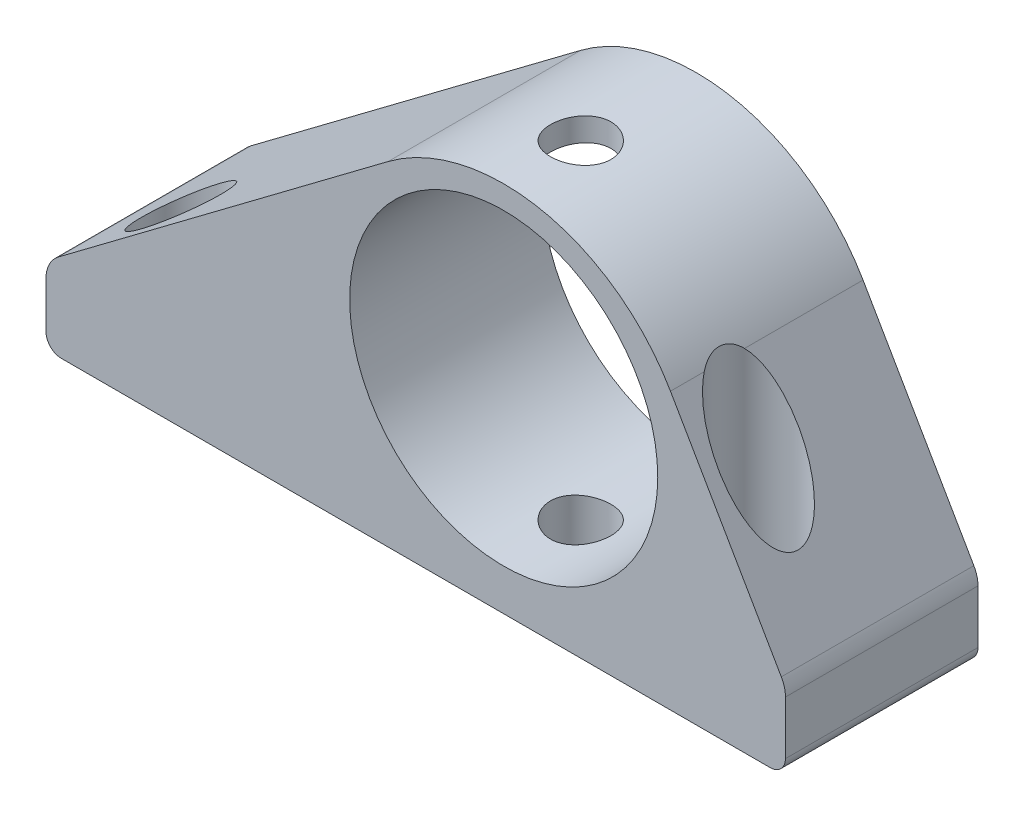
ISO-10303-21;
HEADER;
FILE_DESCRIPTION(('STEP AP214'),'2;1');
FILE_NAME('part.step','',(''),(''),'','','');
FILE_SCHEMA(('AUTOMOTIVE_DESIGN { 1 0 10303 214 1 1 1 1 }'));
ENDSEC;
DATA;
#1=APPLICATION_CONTEXT('core data for automotive mechanical design processes');
#2=APPLICATION_PROTOCOL_DEFINITION('international standard','automotive_design',2000,#1);
#3=PRODUCT_CONTEXT('',#1,'mechanical');
#4=PRODUCT('Part','Part','',(#3));
#5=PRODUCT_RELATED_PRODUCT_CATEGORY('part','',(#4));
#6=PRODUCT_DEFINITION_FORMATION('','',#4);
#7=PRODUCT_DEFINITION_CONTEXT('part definition',#1,'design');
#8=PRODUCT_DEFINITION('design','',#6,#7);
#9=PRODUCT_DEFINITION_SHAPE('','',#8);
#10=(LENGTH_UNIT() NAMED_UNIT(*) SI_UNIT(.MILLI.,.METRE.));
#11=(NAMED_UNIT(*) PLANE_ANGLE_UNIT() SI_UNIT($,.RADIAN.));
#12=(NAMED_UNIT(*) SI_UNIT($,.STERADIAN.) SOLID_ANGLE_UNIT());
#13=UNCERTAINTY_MEASURE_WITH_UNIT(LENGTH_MEASURE(1.E-05),#10,'distance_accuracy_value','');
#14=(GEOMETRIC_REPRESENTATION_CONTEXT(3) GLOBAL_UNCERTAINTY_ASSIGNED_CONTEXT((#13)) GLOBAL_UNIT_ASSIGNED_CONTEXT((#10,
#11,#12)) REPRESENTATION_CONTEXT('',''));
#15=CARTESIAN_POINT('',(0.,0.,0.));
#16=DIRECTION('',(0.,0.,1.));
#17=DIRECTION('',(1.,0.,0.));
#18=AXIS2_PLACEMENT_3D('',#15,#16,#17);
#19=CARTESIAN_POINT('',(30.48,0.,15.875));
#20=DIRECTION('',(0.,1.,0.));
#21=DIRECTION('',(-1.,0.,0.));
#22=AXIS2_PLACEMENT_3D('',#19,#20,#21);
#23=PLANE('',#22);
#24=CARTESIAN_POINT('',(-23.8125,0.,11.43));
#25=DIRECTION('',(0.,-1.,0.));
#26=DIRECTION('',(1.,0.,0.));
#27=AXIS2_PLACEMENT_3D('',#24,#25,#26);
#28=CIRCLE('',#27,3.2639);
#29=CARTESIAN_POINT('',(-20.5486,0.,11.43));
#30=VERTEX_POINT('',#29);
#31=EDGE_CURVE('E421',#30,#30,#28,.T.);
#32=ORIENTED_EDGE('',*,*,#31,.F.);
#33=EDGE_LOOP('',(#32));
#34=FACE_BOUND('',#33,.T.);
#35=CARTESIAN_POINT('',(7.25400300007424,0.,9.525));
#36=DIRECTION('',(0.,-1.,0.));
#37=DIRECTION('',(1.,0.,0.));
#38=AXIS2_PLACEMENT_3D('',#35,#36,#37);
#39=CIRCLE('',#38,2.4892);
#40=CARTESIAN_POINT('',(9.74320300007424,0.,9.525));
#41=VERTEX_POINT('',#40);
#42=EDGE_CURVE('E157',#41,#41,#39,.T.);
#43=ORIENTED_EDGE('',*,*,#42,.F.);
#44=EDGE_LOOP('',(#43));
#45=FACE_BOUND('',#44,.T.);
#46=DIRECTION('',(1.,0.,0.));
#47=VECTOR('',#46,1.);
#48=CARTESIAN_POINT('',(30.48,0.,0.));
#49=LINE('',#48,#47);
#50=CARTESIAN_POINT('',(-29.21,0.,0.));
#51=VERTEX_POINT('',#50);
#52=CARTESIAN_POINT('',(29.21,0.,0.));
#53=VERTEX_POINT('',#52);
#54=EDGE_CURVE('E251',#51,#53,#49,.T.);
#55=ORIENTED_EDGE('',*,*,#54,.T.);
#56=DIRECTION('',(0.,0.,-1.));
#57=VECTOR('',#56,1.);
#58=CARTESIAN_POINT('',(29.21,0.,15.875));
#59=LINE('',#58,#57);
#60=CARTESIAN_POINT('',(29.21,0.,15.875));
#61=VERTEX_POINT('',#60);
#62=EDGE_CURVE('E54',#53,#61,#59,.F.);
#63=ORIENTED_EDGE('',*,*,#62,.T.);
#64=DIRECTION('',(1.,0.,0.));
#65=VECTOR('',#64,1.);
#66=CARTESIAN_POINT('',(30.48,0.,15.875));
#67=LINE('',#66,#65);
#68=CARTESIAN_POINT('',(-29.21,0.,15.875));
#69=VERTEX_POINT('',#68);
#70=EDGE_CURVE('E237',#69,#61,#67,.T.);
#71=ORIENTED_EDGE('',*,*,#70,.F.);
#72=DIRECTION('',(0.,0.,-1.));
#73=VECTOR('',#72,1.);
#74=CARTESIAN_POINT('',(-29.21,0.,15.875));
#75=LINE('',#74,#73);
#76=EDGE_CURVE('E227',#69,#51,#75,.T.);
#77=ORIENTED_EDGE('',*,*,#76,.T.);
#78=EDGE_LOOP('',(#55,#63,#71,#77));
#79=FACE_BOUND('',#78,.T.);
#80=CARTESIAN_POINT('',(23.8125,0.,11.43));
#81=DIRECTION('',(0.,1.,0.));
#82=DIRECTION('',(-1.,0.,0.));
#83=AXIS2_PLACEMENT_3D('',#80,#81,#82);
#84=CIRCLE('',#83,3.2639);
#85=CARTESIAN_POINT('',(20.5486,0.,11.43));
#86=VERTEX_POINT('',#85);
#87=EDGE_CURVE('E423',#86,#86,#84,.T.);
#88=ORIENTED_EDGE('',*,*,#87,.T.);
#89=EDGE_LOOP('',(#88));
#90=FACE_BOUND('',#89,.T.);
#91=ADVANCED_FACE('F33',(#34,#45,#79,#90),#23,.F.);
#92=CARTESIAN_POINT('',(7.25400300007437,14.8286068603137,15.875));
#93=DIRECTION('',(0.,0.,-1.));
#94=DIRECTION('',(-1.,0.,0.));
#95=AXIS2_PLACEMENT_3D('',#92,#93,#94);
#96=CYLINDRICAL_SURFACE('',#95,15.875);
#97=CARTESIAN_POINT('',(7.25400300007436,30.7036068603138,7.0358));
#98=CARTESIAN_POINT('',(7.11509694516908,30.7036045670808,7.03580566830738));
#99=CARTESIAN_POINT('',(6.97611218193528,30.7017646601866,7.04746642785592));
#100=CARTESIAN_POINT('',(6.70203273456269,30.6946020213534,7.09378656350196));
#101=CARTESIAN_POINT('',(6.56694188282754,30.6892759728483,7.12846784077943));
#102=CARTESIAN_POINT('',(6.30465595873273,30.6757391275832,7.2197628200422));
#103=CARTESIAN_POINT('',(6.17745481318327,30.667530582914,7.27635940315972));
#104=CARTESIAN_POINT('',(5.93437285248977,30.649134007626,7.40983538252462));
#105=CARTESIAN_POINT('',(5.81849057811306,30.6389462326777,7.48671215950087));
#106=CARTESIAN_POINT('',(5.60033208226753,30.6176258243704,7.65926248892496));
#107=CARTESIAN_POINT('',(5.49816608869203,30.606486591927,7.75507460388897));
#108=CARTESIAN_POINT('',(5.31129175300056,30.584569925567,7.96247763511765));
#109=CARTESIAN_POINT('',(5.2265844527291,30.5737925132742,8.07406949236609));
#110=CARTESIAN_POINT('',(5.07659786405079,30.5537557811859,8.31061159654532));
#111=CARTESIAN_POINT('',(5.01142616602649,30.5445049901566,8.43563084963722));
#112=CARTESIAN_POINT('',(4.90304851035311,30.5286596153741,8.69501078415886));
#113=CARTESIAN_POINT('',(4.85984124295902,30.5220648732449,8.82937090804668));
#114=CARTESIAN_POINT('',(4.796963270964,30.5123434963266,9.10245557095464));
#115=CARTESIAN_POINT('',(4.77710320592831,30.5091889745406,9.24113549846165));
#116=CARTESIAN_POINT('',(4.76089657591027,30.5066206687459,9.5198926166484));
#117=CARTESIAN_POINT('',(4.76454853711459,30.5072066502696,9.65996971919892));
#118=CARTESIAN_POINT('',(4.79510774717881,30.5120276567733,9.93620169534438));
#119=CARTESIAN_POINT('',(4.82180337883591,30.5162294753171,10.0723806432635));
#120=CARTESIAN_POINT('',(4.8973605430947,30.527756802887,10.3383023139324));
#121=CARTESIAN_POINT('',(4.94622275573279,30.5350824077457,10.4680448390872));
#122=CARTESIAN_POINT('',(5.06494395719598,30.5520682573595,10.7180505107717));
#123=CARTESIAN_POINT('',(5.13489188306559,30.5617383564174,10.838270726423));
#124=CARTESIAN_POINT('',(5.29373568546492,30.5823166097519,11.0653477084882));
#125=CARTESIAN_POINT('',(5.38263291891857,30.5932248526635,11.1722035170324));
#126=CARTESIAN_POINT('',(5.5780100666752,30.6151967100365,11.3707443017527));
#127=CARTESIAN_POINT('',(5.68467177504527,30.6262607183034,11.4622504315872));
#128=CARTESIAN_POINT('',(5.91193242728109,30.6471868004637,11.6260915712206));
#129=CARTESIAN_POINT('',(6.0325314428575,30.6570488681723,11.6984264823729));
#130=CARTESIAN_POINT('',(6.28440356404981,30.6744715991477,11.8218838501579));
#131=CARTESIAN_POINT('',(6.41568393735495,30.6820306785657,11.8729917169162));
#132=CARTESIAN_POINT('',(6.68510938025784,30.693982711525,11.9523846061197));
#133=CARTESIAN_POINT('',(6.8232539414809,30.6983758991658,11.9806713160762));
#134=CARTESIAN_POINT('',(7.10094359993342,30.7034699636867,12.0133792873864));
#135=CARTESIAN_POINT('',(7.24045908082882,30.7042088572259,12.0180462832909));
#136=CARTESIAN_POINT('',(7.51827959411447,30.7020148184516,12.0040357439755));
#137=CARTESIAN_POINT('',(7.65658466740221,30.6990820106842,11.9853590005889));
#138=CARTESIAN_POINT('',(7.92730824076356,30.6898976195341,11.9253955128908));
#139=CARTESIAN_POINT('',(8.05975407998652,30.6836637272211,11.8842292567787));
#140=CARTESIAN_POINT('',(8.31586409195264,30.6685736529816,11.7805829101506));
#141=CARTESIAN_POINT('',(8.43952781928167,30.6597173381678,11.7181017395089));
#142=CARTESIAN_POINT('',(8.67563860325786,30.6402714771111,11.5730280962491));
#143=CARTESIAN_POINT('',(8.78798935863075,30.6296687944836,11.4902806848561));
#144=CARTESIAN_POINT('',(8.99729740357999,30.607949148022,11.3072381432372));
#145=CARTESIAN_POINT('',(9.09425370997436,30.5968321513994,11.2069418930963));
#146=CARTESIAN_POINT('',(9.27092141526545,30.5752153365864,10.990551469592));
#147=CARTESIAN_POINT('',(9.3504675633996,30.5647220679579,10.8743216252251));
#148=CARTESIAN_POINT('',(9.48890613070782,30.5456592820025,10.630005260061));
#149=CARTESIAN_POINT('',(9.54779914763274,30.537089709002,10.50191908255));
#150=CARTESIAN_POINT('',(9.64300711014341,30.5228927057636,10.2380065380912));
#151=CARTESIAN_POINT('',(9.67940715067546,30.5172541997979,10.1022114919798));
#152=CARTESIAN_POINT('',(9.72886557579246,30.5095289481787,9.82633991313192));
#153=CARTESIAN_POINT('',(9.74192573584276,30.5074419323638,9.68626370688804));
#154=CARTESIAN_POINT('',(9.74428853977138,30.5070666718644,9.40745431443618));
#155=CARTESIAN_POINT('',(9.7338511167597,30.5087368643308,9.26872331762411));
#156=CARTESIAN_POINT('',(9.6900740514347,30.515597201827,8.99501636082486));
#157=CARTESIAN_POINT('',(9.65673445991303,30.5207873390504,8.86004039251059));
#158=CARTESIAN_POINT('',(9.56819443372131,30.534087734728,8.59775830460762));
#159=CARTESIAN_POINT('',(9.51301384157173,30.5421953420586,8.47044534380261));
#160=CARTESIAN_POINT('',(9.38238434924553,30.5604201058444,8.226842109909));
#161=CARTESIAN_POINT('',(9.30693463532861,30.5705373429755,8.11055227961739));
#162=CARTESIAN_POINT('',(9.13697081950566,30.5917743120337,7.89097857161323));
#163=CARTESIAN_POINT('',(9.04226469105313,30.6029034623595,7.78784422655511));
#164=CARTESIAN_POINT('',(8.83688213281055,30.62483305306,7.59884086657932));
#165=CARTESIAN_POINT('',(8.72620200791413,30.6356334166778,7.51297585743608));
#166=CARTESIAN_POINT('',(8.49122209404987,30.6557636174166,7.3604800108145));
#167=CARTESIAN_POINT('',(8.36684397860286,30.6650841653116,7.29396864775475));
#168=CARTESIAN_POINT('',(8.10859057986397,30.6811138402597,7.18288238350642));
#169=CARTESIAN_POINT('',(7.9747251443983,30.6878256295893,7.13828510632219));
#170=CARTESIAN_POINT('',(7.74257567355938,30.6963760297984,7.08223803977048));
#171=CARTESIAN_POINT('',(7.64571373853054,30.6990734420586,7.06485088867004));
#172=CARTESIAN_POINT('',(7.45058199718362,30.7026896561761,7.0416299450843));
#173=CARTESIAN_POINT('',(7.35231221090446,30.7036084833238,7.03579598831868));
#174=CARTESIAN_POINT('',(7.25400300007436,30.7036068603138,7.0358));
#175=B_SPLINE_CURVE_WITH_KNOTS('',3,(#97,#98,#99,#100,#101,#102,#103,#104,#105,#106,#107,#108,
#109,#110,#111,#112,#113,#114,#115,#116,#117,#118,#119,#120,#121,#122,#123,#124,#125,#126,#127,
#128,#129,#130,#131,#132,#133,#134,#135,#136,#137,#138,#139,#140,#141,#142,#143,#144,#145,#146,
#147,#148,#149,#150,#151,#152,#153,#154,#155,#156,#157,#158,#159,#160,#161,#162,#163,#164,#165,
#166,#167,#168,#169,#170,#171,#172,#173,#174),.UNSPECIFIED.,.T.,.F.,(4,2,2,2,2,2,2,2,2,2,2,2,2,
2,2,2,2,2,2,2,2,2,2,2,2,2,2,2,2,2,2,2,2,2,2,2,2,2,4),(0.,0.416358886850114,0.833114456601983,
1.24954513752971,1.66592206101775,2.08546693141594,2.50503683083742,2.9268767192471,
3.34869145027715,3.76706086480886,4.18540405478608,4.5999458526052,5.01450036878518,
5.43082849175457,5.8471864372113,6.26810144417728,6.68901861694429,7.11022461967684,
7.5313994734613,7.94818337190888,8.36495313318789,8.77951162893622,9.19409113540896,
9.61194492985803,10.0298254002349,10.4515150266721,10.8731924473988,11.2932646607082,
11.7133049177523,12.1287214978065,12.5441371565667,12.9591762738235,13.3742320560615,
13.793649932368,14.213164984421,14.6352173742595,15.0568379154241,15.3515154632021,
15.6461888207907),.UNSPECIFIED.);
#176=CARTESIAN_POINT('',(7.25400300007436,30.7036068603138,7.0358));
#177=VERTEX_POINT('',#176);
#178=EDGE_CURVE('E136',#177,#177,#175,.T.);
#179=ORIENTED_EDGE('',*,*,#178,.F.);
#180=EDGE_LOOP('',(#179));
#181=FACE_BOUND('',#180,.T.);
#182=DIRECTION('',(0.,0.,-1.));
#183=VECTOR('',#182,1.);
#184=CARTESIAN_POINT('',(21.0021562851524,22.7661068603137,15.875));
#185=LINE('',#184,#183);
#186=CARTESIAN_POINT('',(21.0021562851524,22.7661068603137,13.0898227057178));
#187=VERTEX_POINT('',#186);
#188=CARTESIAN_POINT('',(21.0021562851524,22.7661068603137,15.875));
#189=VERTEX_POINT('',#188);
#190=EDGE_CURVE('E132',#187,#189,#185,.F.);
#191=ORIENTED_EDGE('',*,*,#190,.F.);
#192=CARTESIAN_POINT('',(21.0021562851524,22.7661068603137,13.0898227057178));
#193=CARTESIAN_POINT('',(20.9533733668285,22.8506642981998,13.0072056712202));
#194=CARTESIAN_POINT('',(20.9059806513669,22.9308834683026,12.9186482306213));
#195=CARTESIAN_POINT('',(20.8161566126228,23.0803375507149,12.7285343637837));
#196=CARTESIAN_POINT('',(20.7737923904778,23.1494275345428,12.6268333853953));
#197=CARTESIAN_POINT('',(20.6972629948974,23.2725250502104,12.4105821737075));
#198=CARTESIAN_POINT('',(20.663155677112,23.3264265652036,12.2959490810612));
#199=CARTESIAN_POINT('',(20.6070599093164,23.4143066322154,12.0569972875116));
#200=CARTESIAN_POINT('',(20.5850107900353,23.4483849781978,11.9327307345026));
#201=CARTESIAN_POINT('',(20.557105483573,23.4913828134271,11.6918431381413));
#202=CARTESIAN_POINT('',(20.5497833305059,23.5025819694709,11.5758034890898));
#203=CARTESIAN_POINT('',(20.5476838890129,23.5058003594034,11.3432610913329));
#204=CARTESIAN_POINT('',(20.5529117954202,23.4978116508784,11.2267581707929));
#205=CARTESIAN_POINT('',(20.5738252099067,23.4656343985773,11.0127869718901));
#206=CARTESIAN_POINT('',(20.588055815753,23.4436977657935,10.9148198564839));
#207=CARTESIAN_POINT('',(20.6243594611198,23.387246626405,10.7241436924463));
#208=CARTESIAN_POINT('',(20.6464349132975,23.3527282502418,10.6314362716002));
#209=CARTESIAN_POINT('',(20.7061316561934,23.258315389416,10.4202817276119));
#210=CARTESIAN_POINT('',(20.7464873165251,23.1937578904489,10.3046991713266));
#211=CARTESIAN_POINT('',(20.835187881972,23.0489596235374,10.0874275887423));
#212=CARTESIAN_POINT('',(20.8835399489173,22.968704784688,9.98575116771974));
#213=CARTESIAN_POINT('',(20.9564934029945,22.8448008503922,9.84934535525286));
#214=CARTESIAN_POINT('',(20.9791626099352,22.805941967419,9.80911854426729));
#215=CARTESIAN_POINT('',(21.0021562851523,22.7661068603139,9.77017729428192));
#216=B_SPLINE_CURVE_WITH_KNOTS('',3,(#192,#193,#194,#195,#196,#197,#198,#199,#200,#201,#202,
#203,#204,#205,#206,#207,#208,#209,#210,#211,#212,#213,#214,#215),.UNSPECIFIED.,.F.,.F.,(4,2,2,
2,2,2,2,2,2,2,2,4),(0.,0.38412317117787,0.772902376602331,1.16433162437198,1.5537728900391,
1.90202601303818,2.25042331294998,2.55332079770331,2.85631151833553,3.26923036669984,
3.68252106098251,3.86342961856172),.UNSPECIFIED.);
#217=CARTESIAN_POINT('',(21.0021562851524,22.7661068603137,9.77017729428215));
#218=VERTEX_POINT('',#217);
#219=EDGE_CURVE('E117',#187,#218,#216,.T.);
#220=ORIENTED_EDGE('',*,*,#219,.T.);
#221=CARTESIAN_POINT('',(21.0021562851524,22.7661068603137,0.));
#222=VERTEX_POINT('',#221);
#223=EDGE_CURVE('E134',#222,#218,#185,.F.);
#224=ORIENTED_EDGE('',*,*,#223,.F.);
#225=CARTESIAN_POINT('',(7.25400300007437,14.8286068603137,0.));
#226=DIRECTION('',(0.,0.,1.));
#227=DIRECTION('',(1.,0.,0.));
#228=AXIS2_PLACEMENT_3D('',#225,#226,#227);
#229=CIRCLE('',#228,15.875);
#230=CARTESIAN_POINT('',(-2.27729126755683,27.523883721565,0.));
#231=VERTEX_POINT('',#230);
#232=EDGE_CURVE('E140',#231,#222,#229,.F.);
#233=ORIENTED_EDGE('',*,*,#232,.F.);
#234=DIRECTION('',(0.,0.,-1.));
#235=VECTOR('',#234,1.);
#236=CARTESIAN_POINT('',(-2.27729126755683,27.523883721565,15.875));
#237=LINE('',#236,#235);
#238=CARTESIAN_POINT('',(-2.27729126755683,27.523883721565,15.875));
#239=VERTEX_POINT('',#238);
#240=EDGE_CURVE('E143',#239,#231,#237,.T.);
#241=ORIENTED_EDGE('',*,*,#240,.F.);
#242=CARTESIAN_POINT('',(7.25400300007437,14.8286068603137,15.875));
#243=DIRECTION('',(0.,0.,1.));
#244=DIRECTION('',(1.,0.,0.));
#245=AXIS2_PLACEMENT_3D('',#242,#243,#244);
#246=CIRCLE('',#245,15.875);
#247=EDGE_CURVE('E126',#189,#239,#246,.T.);
#248=ORIENTED_EDGE('',*,*,#247,.F.);
#249=EDGE_LOOP('',(#191,#220,#224,#233,#241,#248));
#250=FACE_BOUND('',#249,.T.);
#251=ADVANCED_FACE('F138',(#181,#250),#96,.T.);
#252=CARTESIAN_POINT('',(-30.48,0.,15.875));
#253=DIRECTION('',(1.,0.,0.));
#254=DIRECTION('',(0.,0.,-1.));
#255=AXIS2_PLACEMENT_3D('',#252,#253,#254);
#256=PLANE('',#255);
#257=DIRECTION('',(0.,-1.,0.));
#258=VECTOR('',#257,1.);
#259=CARTESIAN_POINT('',(-30.48,0.,0.));
#260=LINE('',#259,#258);
#261=CARTESIAN_POINT('',(-30.48,5.08078683227482,0.));
#262=VERTEX_POINT('',#261);
#263=CARTESIAN_POINT('',(-30.48,1.27,0.));
#264=VERTEX_POINT('',#263);
#265=EDGE_CURVE('E255',#262,#264,#260,.T.);
#266=ORIENTED_EDGE('',*,*,#265,.T.);
#267=DIRECTION('',(0.,0.,-1.));
#268=VECTOR('',#267,1.);
#269=CARTESIAN_POINT('',(-30.48,1.27,15.875));
#270=LINE('',#269,#268);
#271=CARTESIAN_POINT('',(-30.48,1.27,15.875));
#272=VERTEX_POINT('',#271);
#273=EDGE_CURVE('E11',#264,#272,#270,.F.);
#274=ORIENTED_EDGE('',*,*,#273,.T.);
#275=DIRECTION('',(0.,-1.,0.));
#276=VECTOR('',#275,1.);
#277=CARTESIAN_POINT('',(-30.48,0.,15.875));
#278=LINE('',#277,#276);
#279=CARTESIAN_POINT('',(-30.48,5.08078683227482,15.875));
#280=VERTEX_POINT('',#279);
#281=EDGE_CURVE('E266',#280,#272,#278,.T.);
#282=ORIENTED_EDGE('',*,*,#281,.F.);
#283=DIRECTION('',(0.,0.,-1.));
#284=VECTOR('',#283,1.);
#285=CARTESIAN_POINT('',(-30.48,5.08078683227482,15.875));
#286=LINE('',#285,#284);
#287=EDGE_CURVE('E125',#280,#262,#286,.T.);
#288=ORIENTED_EDGE('',*,*,#287,.T.);
#289=EDGE_LOOP('',(#266,#274,#282,#288));
#290=FACE_BOUND('',#289,.T.);
#291=ADVANCED_FACE('F187',(#290),#256,.F.);
#292=CARTESIAN_POINT('',(30.48,6.35000000000001,15.875));
#293=DIRECTION('',(-1.,0.,0.));
#294=DIRECTION('',(0.,-1.,0.));
#295=AXIS2_PLACEMENT_3D('',#292,#293,#294);
#296=PLANE('',#295);
#297=DIRECTION('',(0.,1.,0.));
#298=VECTOR('',#297,1.);
#299=CARTESIAN_POINT('',(30.48,6.35000000000001,15.875));
#300=LINE('',#299,#298);
#301=CARTESIAN_POINT('',(30.48,1.27000000000002,15.875));
#302=VERTEX_POINT('',#301);
#303=CARTESIAN_POINT('',(30.48,5.66940905122498,15.875));
#304=VERTEX_POINT('',#303);
#305=EDGE_CURVE('E236',#302,#304,#300,.T.);
#306=ORIENTED_EDGE('',*,*,#305,.F.);
#307=DIRECTION('',(0.,0.,-1.));
#308=VECTOR('',#307,1.);
#309=CARTESIAN_POINT('',(30.48,1.27000000000002,15.875));
#310=LINE('',#309,#308);
#311=CARTESIAN_POINT('',(30.48,1.27000000000002,0.));
#312=VERTEX_POINT('',#311);
#313=EDGE_CURVE('E220',#302,#312,#310,.T.);
#314=ORIENTED_EDGE('',*,*,#313,.T.);
#315=DIRECTION('',(0.,1.,0.));
#316=VECTOR('',#315,1.);
#317=CARTESIAN_POINT('',(30.48,6.35000000000001,0.));
#318=LINE('',#317,#316);
#319=CARTESIAN_POINT('',(30.48,5.66940905122498,0.));
#320=VERTEX_POINT('',#319);
#321=EDGE_CURVE('E252',#312,#320,#318,.T.);
#322=ORIENTED_EDGE('',*,*,#321,.T.);
#323=DIRECTION('',(0.,0.,-1.));
#324=VECTOR('',#323,1.);
#325=CARTESIAN_POINT('',(30.48,5.66940905122498,15.875));
#326=LINE('',#325,#324);
#327=EDGE_CURVE('E217',#320,#304,#326,.F.);
#328=ORIENTED_EDGE('',*,*,#327,.T.);
#329=EDGE_LOOP('',(#306,#314,#322,#328));
#330=FACE_BOUND('',#329,.T.);
#331=ADVANCED_FACE('F241',(#330),#296,.F.);
#332=CARTESIAN_POINT('',(12.0464729957814,38.277805334,15.875));
#333=DIRECTION('',(-0.866025403784442,-0.499999999999995,0.));
#334=DIRECTION('',(0.499999999999995,-0.866025403784442,0.));
#335=AXIS2_PLACEMENT_3D('',#332,#333,#334);
#336=PLANE('',#335);
#337=DIRECTION('',(-0.499999999999995,0.866025403784442,0.));
#338=VECTOR('',#337,1.);
#339=CARTESIAN_POINT('',(12.0464729957814,38.277805334,15.875));
#340=LINE('',#339,#338);
#341=CARTESIAN_POINT('',(30.1397045256125,6.93940905122496,15.875));
#342=VERTEX_POINT('',#341);
#343=EDGE_CURVE('E245',#342,#189,#340,.T.);
#344=ORIENTED_EDGE('',*,*,#343,.F.);
#345=DIRECTION('',(0.,0.,-1.));
#346=VECTOR('',#345,1.);
#347=CARTESIAN_POINT('',(30.1397045256125,6.93940905122496,15.875));
#348=LINE('',#347,#346);
#349=CARTESIAN_POINT('',(30.1397045256125,6.93940905122496,0.));
#350=VERTEX_POINT('',#349);
#351=EDGE_CURVE('E214',#342,#350,#348,.T.);
#352=ORIENTED_EDGE('',*,*,#351,.T.);
#353=DIRECTION('',(-0.499999999999995,0.866025403784442,0.));
#354=VECTOR('',#353,1.);
#355=CARTESIAN_POINT('',(12.0464729957814,38.277805334,0.));
#356=LINE('',#355,#354);
#357=EDGE_CURVE('E257',#350,#222,#356,.T.);
#358=ORIENTED_EDGE('',*,*,#357,.T.);
#359=ORIENTED_EDGE('',*,*,#223,.T.);
#360=CARTESIAN_POINT('',(23.8125,17.8984487594657,11.43));
#361=DIRECTION('',(-0.866025403784442,-0.499999999999995,0.));
#362=DIRECTION('',(0.499999999999995,-0.866025403784442,0.));
#363=AXIS2_PLACEMENT_3D('',#360,#361,#362);
#364=ELLIPSE('',#363,6.52780000000007,3.2639);
#365=EDGE_CURVE('E120',#187,#218,#364,.F.);
#366=ORIENTED_EDGE('',*,*,#365,.F.);
#367=ORIENTED_EDGE('',*,*,#190,.T.);
#368=EDGE_LOOP('',(#344,#352,#358,#359,#366,#367));
#369=FACE_BOUND('',#368,.T.);
#370=ADVANCED_FACE('F131',(#369),#336,.F.);
#371=CARTESIAN_POINT('',(-30.48,6.34999999999999,15.875));
#372=DIRECTION('',(0.600396489299603,-0.799702479448896,0.));
#373=DIRECTION('',(0.799702479448896,0.600396489299603,0.));
#374=AXIS2_PLACEMENT_3D('',#371,#372,#373);
#375=PLANE('',#374);
#376=CARTESIAN_POINT('',(-23.8125,11.3557911476826,11.43));
#377=DIRECTION('',(0.600396489299603,-0.799702479448896,0.));
#378=DIRECTION('',(-0.799702479448896,-0.600396489299603,0.));
#379=AXIS2_PLACEMENT_3D('',#376,#377,#378);
#380=ELLIPSE('',#379,4.08139287282099,3.2639);
#381=CARTESIAN_POINT('',(-27.0764,8.90533719538843,11.43));
#382=VERTEX_POINT('',#381);
#383=EDGE_CURVE('E135',#382,#382,#380,.T.);
#384=ORIENTED_EDGE('',*,*,#383,.T.);
#385=EDGE_LOOP('',(#384));
#386=FACE_BOUND('',#385,.T.);
#387=DIRECTION('',(-0.799702479448896,-0.600396489299603,0.));
#388=VECTOR('',#387,1.);
#389=CARTESIAN_POINT('',(-30.48,6.34999999999999,0.));
#390=LINE('',#389,#388);
#391=CARTESIAN_POINT('',(-29.465007082821,7.11203113007502,0.));
#392=VERTEX_POINT('',#391);
#393=EDGE_CURVE('E264',#231,#392,#390,.T.);
#394=ORIENTED_EDGE('',*,*,#393,.T.);
#395=DIRECTION('',(0.,0.,-1.));
#396=VECTOR('',#395,1.);
#397=CARTESIAN_POINT('',(-29.465007082821,7.11203113007502,15.875));
#398=LINE('',#397,#396);
#399=CARTESIAN_POINT('',(-29.465007082821,7.11203113007502,15.875));
#400=VERTEX_POINT('',#399);
#401=EDGE_CURVE('E208',#392,#400,#398,.F.);
#402=ORIENTED_EDGE('',*,*,#401,.T.);
#403=DIRECTION('',(-0.799702479448896,-0.600396489299603,0.));
#404=VECTOR('',#403,1.);
#405=CARTESIAN_POINT('',(-30.48,6.34999999999999,15.875));
#406=LINE('',#405,#404);
#407=EDGE_CURVE('E268',#239,#400,#406,.T.);
#408=ORIENTED_EDGE('',*,*,#407,.F.);
#409=ORIENTED_EDGE('',*,*,#240,.T.);
#410=EDGE_LOOP('',(#394,#402,#408,#409));
#411=FACE_BOUND('',#410,.T.);
#412=ADVANCED_FACE('F289',(#386,#411),#375,.F.);
#413=CARTESIAN_POINT('',(0.,0.,15.875));
#414=DIRECTION('',(0.,0.,1.));
#415=DIRECTION('',(1.,0.,0.));
#416=AXIS2_PLACEMENT_3D('',#413,#414,#415);
#417=PLANE('',#416);
#418=CARTESIAN_POINT('',(7.25400300007423,16.0986068603137,15.875));
#419=DIRECTION('',(0.,0.,1.));
#420=DIRECTION('',(1.,0.,0.));
#421=AXIS2_PLACEMENT_3D('',#418,#419,#420);
#422=CIRCLE('',#421,12.7);
#423=CARTESIAN_POINT('',(19.9540030000742,16.0986068603137,15.875));
#424=VERTEX_POINT('',#423);
#425=EDGE_CURVE('E200',#424,#424,#422,.T.);
#426=ORIENTED_EDGE('',*,*,#425,.F.);
#427=EDGE_LOOP('',(#426));
#428=FACE_BOUND('',#427,.T.);
#429=ORIENTED_EDGE('',*,*,#70,.T.);
#430=CARTESIAN_POINT('',(29.21,1.27000000000001,15.875));
#431=DIRECTION('',(0.,0.,1.));
#432=DIRECTION('',(1.,0.,0.));
#433=AXIS2_PLACEMENT_3D('',#430,#431,#432);
#434=CIRCLE('',#433,1.27);
#435=EDGE_CURVE('E41',#61,#302,#434,.T.);
#436=ORIENTED_EDGE('',*,*,#435,.T.);
#437=ORIENTED_EDGE('',*,*,#305,.T.);
#438=CARTESIAN_POINT('',(27.94,5.66940905122498,15.875));
#439=DIRECTION('',(0.,0.,1.));
#440=DIRECTION('',(1.,0.,0.));
#441=AXIS2_PLACEMENT_3D('',#438,#439,#440);
#442=CIRCLE('',#441,2.54);
#443=EDGE_CURVE('E210',#304,#342,#442,.T.);
#444=ORIENTED_EDGE('',*,*,#443,.T.);
#445=ORIENTED_EDGE('',*,*,#343,.T.);
#446=ORIENTED_EDGE('',*,*,#247,.T.);
#447=ORIENTED_EDGE('',*,*,#407,.T.);
#448=CARTESIAN_POINT('',(-27.94,5.08078683227482,15.875));
#449=DIRECTION('',(0.,0.,1.));
#450=DIRECTION('',(1.,0.,0.));
#451=AXIS2_PLACEMENT_3D('',#448,#449,#450);
#452=CIRCLE('',#451,2.54);
#453=EDGE_CURVE('E212',#400,#280,#452,.T.);
#454=ORIENTED_EDGE('',*,*,#453,.T.);
#455=ORIENTED_EDGE('',*,*,#281,.T.);
#456=CARTESIAN_POINT('',(-29.21,1.27,15.875));
#457=DIRECTION('',(0.,0.,1.));
#458=DIRECTION('',(1.,0.,0.));
#459=AXIS2_PLACEMENT_3D('',#456,#457,#458);
#460=CIRCLE('',#459,1.27);
#461=EDGE_CURVE('E231',#272,#69,#460,.T.);
#462=ORIENTED_EDGE('',*,*,#461,.T.);
#463=EDGE_LOOP('',(#429,#436,#437,#444,#445,#446,#447,#454,#455,#462));
#464=FACE_BOUND('',#463,.T.);
#465=ADVANCED_FACE('F235',(#428,#464),#417,.T.);
#466=CARTESIAN_POINT('',(0.,0.,0.));
#467=DIRECTION('',(0.,0.,1.));
#468=DIRECTION('',(1.,0.,0.));
#469=AXIS2_PLACEMENT_3D('',#466,#467,#468);
#470=PLANE('',#469);
#471=CARTESIAN_POINT('',(7.25400300007423,16.0986068603137,0.));
#472=DIRECTION('',(0.,0.,1.));
#473=DIRECTION('',(1.,0.,0.));
#474=AXIS2_PLACEMENT_3D('',#471,#472,#473);
#475=CIRCLE('',#474,12.7);
#476=CARTESIAN_POINT('',(19.9540030000742,16.0986068603137,0.));
#477=VERTEX_POINT('',#476);
#478=EDGE_CURVE('E259',#477,#477,#475,.T.);
#479=ORIENTED_EDGE('',*,*,#478,.T.);
#480=EDGE_LOOP('',(#479));
#481=FACE_BOUND('',#480,.T.);
#482=ORIENTED_EDGE('',*,*,#321,.F.);
#483=CARTESIAN_POINT('',(29.21,1.27000000000001,0.));
#484=DIRECTION('',(0.,0.,1.));
#485=DIRECTION('',(1.,0.,0.));
#486=AXIS2_PLACEMENT_3D('',#483,#484,#485);
#487=CIRCLE('',#486,1.27);
#488=EDGE_CURVE('E225',#312,#53,#487,.F.);
#489=ORIENTED_EDGE('',*,*,#488,.T.);
#490=ORIENTED_EDGE('',*,*,#54,.F.);
#491=CARTESIAN_POINT('',(-29.21,1.27,0.));
#492=DIRECTION('',(0.,0.,1.));
#493=DIRECTION('',(1.,0.,0.));
#494=AXIS2_PLACEMENT_3D('',#491,#492,#493);
#495=CIRCLE('',#494,1.27);
#496=EDGE_CURVE('E223',#51,#264,#495,.F.);
#497=ORIENTED_EDGE('',*,*,#496,.T.);
#498=ORIENTED_EDGE('',*,*,#265,.F.);
#499=CARTESIAN_POINT('',(-27.94,5.08078683227482,0.));
#500=DIRECTION('',(0.,0.,1.));
#501=DIRECTION('',(1.,0.,0.));
#502=AXIS2_PLACEMENT_3D('',#499,#500,#501);
#503=CIRCLE('',#502,2.54);
#504=EDGE_CURVE('E206',#262,#392,#503,.F.);
#505=ORIENTED_EDGE('',*,*,#504,.T.);
#506=ORIENTED_EDGE('',*,*,#393,.F.);
#507=ORIENTED_EDGE('',*,*,#232,.T.);
#508=ORIENTED_EDGE('',*,*,#357,.F.);
#509=CARTESIAN_POINT('',(27.94,5.66940905122498,0.));
#510=DIRECTION('',(0.,0.,1.));
#511=DIRECTION('',(1.,0.,0.));
#512=AXIS2_PLACEMENT_3D('',#509,#510,#511);
#513=CIRCLE('',#512,2.54);
#514=EDGE_CURVE('E203',#350,#320,#513,.F.);
#515=ORIENTED_EDGE('',*,*,#514,.T.);
#516=EDGE_LOOP('',(#482,#489,#490,#497,#498,#505,#506,#507,#508,#515));
#517=FACE_BOUND('',#516,.T.);
#518=ADVANCED_FACE('F250',(#481,#517),#470,.F.);
#519=CARTESIAN_POINT('',(7.25400300007423,16.0986068603137,0.));
#520=DIRECTION('',(0.,0.,1.));
#521=DIRECTION('',(1.,0.,0.));
#522=AXIS2_PLACEMENT_3D('',#519,#520,#521);
#523=CYLINDRICAL_SURFACE('',#522,12.7);
#524=CARTESIAN_POINT('',(9.74320300007423,28.552276334007,9.525));
#525=CARTESIAN_POINT('',(9.74319781959507,28.5522790649548,9.38662908287536));
#526=CARTESIAN_POINT('',(9.73162607778495,28.5546075261895,9.24819228470177));
#527=CARTESIAN_POINT('',(9.68568101755662,28.563656788723,8.97523082388027));
#528=CARTESIAN_POINT('',(9.65128909604129,28.5703811735292,8.84070944657046));
#529=CARTESIAN_POINT('',(9.56080761628442,28.5874321112155,8.57956752284425));
#530=CARTESIAN_POINT('',(9.50473919099228,28.5977551547153,8.4529394202798));
#531=CARTESIAN_POINT('',(9.37255353429781,28.6208360963098,8.21089208757875));
#532=CARTESIAN_POINT('',(9.2964375667838,28.6335938408959,8.09547215145594));
#533=CARTESIAN_POINT('',(9.12521511513821,28.6603003424731,7.87754247451788));
#534=CARTESIAN_POINT('',(9.02988855184183,28.6742617167773,7.77520716386536));
#535=CARTESIAN_POINT('',(8.82342642716828,28.7016912066416,7.58787347219764));
#536=CARTESIAN_POINT('',(8.71228978183916,28.7151592883015,7.50287628087115));
#537=CARTESIAN_POINT('',(8.47621021057008,28.7402204893397,7.35195747475634));
#538=CARTESIAN_POINT('',(8.3511596749094,28.7517970003983,7.28620119760572));
#539=CARTESIAN_POINT('',(8.09152070981483,28.7716291301811,7.17669714813406));
#540=CARTESIAN_POINT('',(7.95693313881476,28.7798850473484,7.13294739785694));
#541=CARTESIAN_POINT('',(7.68384992429154,28.7920566394325,7.06924011778698));
#542=CARTESIAN_POINT('',(7.54542538977145,28.7960259734305,7.04898819921366));
#543=CARTESIAN_POINT('',(7.26709031267754,28.7993623635518,7.03193337497407));
#544=CARTESIAN_POINT('',(7.12717990906007,28.7987298463145,7.03512829554281));
#545=CARTESIAN_POINT('',(6.85186622724141,28.7929754962705,7.06465236000582));
#546=CARTESIAN_POINT('',(6.71642747502688,28.7879151937235,7.09066443985872));
#547=CARTESIAN_POINT('',(6.45187525538553,28.7739431164146,7.16458199929412));
#548=CARTESIAN_POINT('',(6.32276203407078,28.7650311919272,7.21248832998448));
#549=CARTESIAN_POINT('',(6.07361646360715,28.744255341242,7.32913096632538));
#550=CARTESIAN_POINT('',(5.953644186923,28.7323737728476,7.39799231439865));
#551=CARTESIAN_POINT('',(5.72683995715791,28.7069698135975,7.55449786688812));
#552=CARTESIAN_POINT('',(5.62000946100786,28.6934472411454,7.64214415090124));
#553=CARTESIAN_POINT('',(5.42064068128666,28.6659890915782,7.83547356857921));
#554=CARTESIAN_POINT('',(5.32837168142999,28.6520503903751,7.94143415867449));
#555=CARTESIAN_POINT('',(5.16287064667453,28.6255462941294,8.16746465929382));
#556=CARTESIAN_POINT('',(5.08963894395472,28.6129809230521,8.28753481596054));
#557=CARTESIAN_POINT('',(4.9642036934437,28.5906405530808,8.53875311566457));
#558=CARTESIAN_POINT('',(4.91204227880375,28.5808711564035,8.66992282697204));
#559=CARTESIAN_POINT('',(4.8305764767098,28.5653121712178,8.93939991212237));
#560=CARTESIAN_POINT('',(4.80126923839401,28.559522086335,9.07770639341906));
#561=CARTESIAN_POINT('',(4.76674313381255,28.5526763406698,9.35509441755144));
#562=CARTESIAN_POINT('',(4.76113604995961,28.5515443861572,9.49412580884298));
#563=CARTESIAN_POINT('',(4.77312606715308,28.5539384804141,9.77113762550663));
#564=CARTESIAN_POINT('',(4.79072190772046,28.5574642761552,9.90911810755894));
#565=CARTESIAN_POINT('',(4.84828406386052,28.5687052800138,10.178815809764));
#566=CARTESIAN_POINT('',(4.88804422889215,28.5763818621579,10.3105787846375));
#567=CARTESIAN_POINT('',(4.98858651648937,28.5950258048394,10.5655728547808));
#568=CARTESIAN_POINT('',(5.04937031193228,28.60599342724,10.6888032701672));
#569=CARTESIAN_POINT('',(5.19111802324772,28.6301558398622,10.9249366734365));
#570=CARTESIAN_POINT('',(5.27232561562493,28.6433768525231,11.0376906504927));
#571=CARTESIAN_POINT('',(5.45228969005974,28.6704838349441,11.2481124049702));
#572=CARTESIAN_POINT('',(5.55104790340508,28.6843698702068,11.3457786922823));
#573=CARTESIAN_POINT('',(5.76504972486813,28.711489106784,11.5247175516523));
#574=CARTESIAN_POINT('',(5.88051428682718,28.7247097139935,11.6057280892576));
#575=CARTESIAN_POINT('',(6.12363988977761,28.7487918284856,11.7472002863924));
#576=CARTESIAN_POINT('',(6.25130043165067,28.7596534322505,11.8076627863857));
#577=CARTESIAN_POINT('',(6.51449388391028,28.7777398293256,11.9059372877511));
#578=CARTESIAN_POINT('',(6.64997867802412,28.7849846585739,11.9438743009439));
#579=CARTESIAN_POINT('',(6.92555331226979,28.7951069963248,11.9964179993294));
#580=CARTESIAN_POINT('',(7.06564261884159,28.7979850090336,12.0110273780141));
#581=CARTESIAN_POINT('',(7.343943532348,28.7990381368231,12.0164002208906));
#582=CARTESIAN_POINT('',(7.48214738068301,28.7972910643415,12.0075582263228));
#583=CARTESIAN_POINT('',(7.75505925888278,28.789453302364,11.9671481595938));
#584=CARTESIAN_POINT('',(7.88976732916311,28.7833626631083,11.935580350293));
#585=CARTESIAN_POINT('',(8.15163010451112,28.7675235867781,11.8507871758175));
#586=CARTESIAN_POINT('',(8.27880008627623,28.7577828625213,11.7976074578334));
#587=CARTESIAN_POINT('',(8.5224694156035,28.7356942683448,11.6711490496278));
#588=CARTESIAN_POINT('',(8.63896796023512,28.7233462024766,11.5978688486784));
#589=CARTESIAN_POINT('',(8.85994328506741,28.6971601124769,11.4319498549602));
#590=CARTESIAN_POINT('',(8.96420507345693,28.6833019135074,11.3390278823627));
#591=CARTESIAN_POINT('',(9.15579188571706,28.6557797035905,11.137046820945));
#592=CARTESIAN_POINT('',(9.24311290298703,28.6421157392872,11.027983925419));
#593=CARTESIAN_POINT('',(9.39918823510413,28.6163749788666,10.7954746338733));
#594=CARTESIAN_POINT('',(9.4677427146263,28.6043159191255,10.671892055115));
#595=CARTESIAN_POINT('',(9.58300532063039,28.5833658792908,10.4147624113143));
#596=CARTESIAN_POINT('',(9.62973352858358,28.574471988854,10.281224637369));
#597=CARTESIAN_POINT('',(9.69081318095695,28.5626605942331,10.0436283138243));
#598=CARTESIAN_POINT('',(9.71042469860954,28.5587902990952,9.94093698210533));
#599=CARTESIAN_POINT('',(9.73662135494774,28.5535971790779,9.73384290783414));
#600=CARTESIAN_POINT('',(9.74320691021948,28.55227427273,9.62944022012084));
#601=CARTESIAN_POINT('',(9.74320300007423,28.552276334007,9.525));
#602=B_SPLINE_CURVE_WITH_KNOTS('',3,(#524,#525,#526,#527,#528,#529,#530,#531,#532,#533,#534,
#535,#536,#537,#538,#539,#540,#541,#542,#543,#544,#545,#546,#547,#548,#549,#550,#551,#552,#553,
#554,#555,#556,#557,#558,#559,#560,#561,#562,#563,#564,#565,#566,#567,#568,#569,#570,#571,#572,
#573,#574,#575,#576,#577,#578,#579,#580,#581,#582,#583,#584,#585,#586,#587,#588,#589,#590,#591,
#592,#593,#594,#595,#596,#597,#598,#599,#600,#601),.UNSPECIFIED.,.T.,.F.,(4,2,2,2,2,2,2,2,2,2,2,
2,2,2,2,2,2,2,2,2,2,2,2,2,2,2,2,2,2,2,2,2,2,2,2,2,2,2,4),(0.,0.414730414305405,
0.829799334472435,1.24446461019687,1.65910374978978,2.07879480704156,2.49851465252995,
2.92174182825096,3.34493095733166,3.76275894344208,4.18054819305723,4.59262226634966,
5.00471235979825,5.41931136201013,5.83395628636838,6.25554457631024,6.67714022199027,
7.09957478601544,7.52195664653157,7.9373922528585,8.35280529193094,8.76441753002944,
9.17606252818106,9.59287344141038,10.0097254939582,10.4327040194989,10.8556652421274,
11.2762566281744,11.6967994477264,12.1103122006605,12.5238201707383,12.9364592596322,
13.3491293704813,13.7682134346203,14.1873964943113,14.6108834376307,15.0339799764711,
15.3470220663788,15.6600541446575),.UNSPECIFIED.);
#603=CARTESIAN_POINT('',(9.74320300007423,28.552276334007,9.525));
#604=VERTEX_POINT('',#603);
#605=EDGE_CURVE('E156',#604,#604,#602,.T.);
#606=ORIENTED_EDGE('',*,*,#605,.T.);
#607=EDGE_LOOP('',(#606));
#608=FACE_BOUND('',#607,.T.);
#609=CARTESIAN_POINT('',(9.74320300007424,3.64493738662045,9.525));
#610=CARTESIAN_POINT('',(9.74319781959507,3.64493465567265,9.66337091712463));
#611=CARTESIAN_POINT('',(9.73162607778496,3.64260619443795,9.80180771529823));
#612=CARTESIAN_POINT('',(9.68568101755663,3.63355693190446,10.0747691761197));
#613=CARTESIAN_POINT('',(9.6512890960413,3.62683254709824,10.2092905534295));
#614=CARTESIAN_POINT('',(9.56080761628442,3.60978160941196,10.4704324771557));
#615=CARTESIAN_POINT('',(9.50473919099229,3.59945856591217,10.5970605797202));
#616=CARTESIAN_POINT('',(9.37255353429782,3.57637762431768,10.8391079124212));
#617=CARTESIAN_POINT('',(9.2964375667838,3.5636198797316,10.9545278485441));
#618=CARTESIAN_POINT('',(9.12521511513822,3.53691337815434,11.1724575254821));
#619=CARTESIAN_POINT('',(9.02988855184184,3.52295200385019,11.2747928361346));
#620=CARTESIAN_POINT('',(8.82342642716829,3.49552251398588,11.4621265278024));
#621=CARTESIAN_POINT('',(8.71228978183917,3.48205443232593,11.5471237191288));
#622=CARTESIAN_POINT('',(8.47621021057009,3.45699323128774,11.6980425252436));
#623=CARTESIAN_POINT('',(8.3511596749094,3.44541672022916,11.7637988023943));
#624=CARTESIAN_POINT('',(8.09152070981484,3.42558459044636,11.8733028518659));
#625=CARTESIAN_POINT('',(7.95693313881477,3.4173286732791,11.9170526021431));
#626=CARTESIAN_POINT('',(7.68384992429155,3.40515708119496,11.980759882213));
#627=CARTESIAN_POINT('',(7.54542538977146,3.40118774719697,12.0010118007863));
#628=CARTESIAN_POINT('',(7.26709031267754,3.39785135707567,12.0180666250259));
#629=CARTESIAN_POINT('',(7.12717990906008,3.39848387431302,12.0148717044572));
#630=CARTESIAN_POINT('',(6.85186622724142,3.40423822435695,11.9853476399942));
#631=CARTESIAN_POINT('',(6.71642747502688,3.40929852690399,11.9593355601413));
#632=CARTESIAN_POINT('',(6.45187525538554,3.42327060421288,11.8854180007059));
#633=CARTESIAN_POINT('',(6.32276203407079,3.43218252870032,11.8375116700155));
#634=CARTESIAN_POINT('',(6.07361646360716,3.45295837938551,11.7208690336746));
#635=CARTESIAN_POINT('',(5.95364418692301,3.46483994777991,11.6520076856013));
#636=CARTESIAN_POINT('',(5.72683995715791,3.49024390703002,11.4955021331119));
#637=CARTESIAN_POINT('',(5.62000946100787,3.50376647948205,11.4078558490988));
#638=CARTESIAN_POINT('',(5.42064068128666,3.53122462904927,11.2145264314208));
#639=CARTESIAN_POINT('',(5.32837168143,3.54516333025239,11.1085658413255));
#640=CARTESIAN_POINT('',(5.16287064667454,3.57166742649804,10.8825353407062));
#641=CARTESIAN_POINT('',(5.08963894395473,3.58423279757532,10.7624651840395));
#642=CARTESIAN_POINT('',(4.9642036934437,3.60657316754668,10.5112468843354));
#643=CARTESIAN_POINT('',(4.91204227880376,3.61634256422393,10.380077173028));
#644=CARTESIAN_POINT('',(4.83057647670981,3.63190154940971,10.1106000878776));
#645=CARTESIAN_POINT('',(4.80126923839402,3.63769163429243,9.97229360658093));
#646=CARTESIAN_POINT('',(4.76674313381256,3.6445373799577,9.69490558244855));
#647=CARTESIAN_POINT('',(4.76113604995962,3.64566933447023,9.55587419115701));
#648=CARTESIAN_POINT('',(4.77312606715309,3.64327524021339,9.27886237449337));
#649=CARTESIAN_POINT('',(4.79072190772047,3.6397494444723,9.14088189244105));
#650=CARTESIAN_POINT('',(4.84828406386052,3.62850844061367,8.87118419023598));
#651=CARTESIAN_POINT('',(4.88804422889216,3.62083185846961,8.73942121536253));
#652=CARTESIAN_POINT('',(4.98858651648938,3.60218791578808,8.48442714521915));
#653=CARTESIAN_POINT('',(5.04937031193229,3.5912202933875,8.36119672983276));
#654=CARTESIAN_POINT('',(5.19111802324773,3.56705788076527,8.1250633265635));
#655=CARTESIAN_POINT('',(5.27232561562494,3.55383686810434,8.01230934950728));
#656=CARTESIAN_POINT('',(5.45228969005974,3.52672988568336,7.80188759502976));
#657=CARTESIAN_POINT('',(5.55104790340509,3.51284385042072,7.70422130771773));
#658=CARTESIAN_POINT('',(5.76504972486814,3.48572461384346,7.52528244834767));
#659=CARTESIAN_POINT('',(5.88051428682718,3.47250400663398,7.44427191074244));
#660=CARTESIAN_POINT('',(6.12363988977762,3.44842189214191,7.30279971360759));
#661=CARTESIAN_POINT('',(6.25130043165067,3.43756028837702,7.24233721361427));
#662=CARTESIAN_POINT('',(6.51449388391029,3.41947389130192,7.14406271224889));
#663=CARTESIAN_POINT('',(6.64997867802413,3.41222906205357,7.10612569905611));
#664=CARTESIAN_POINT('',(6.9255533122698,3.4021067243027,7.05358200067058));
#665=CARTESIAN_POINT('',(7.0656426188416,3.39922871159387,7.03897262198589));
#666=CARTESIAN_POINT('',(7.34394353234801,3.39817558380443,7.03359977910936));
#667=CARTESIAN_POINT('',(7.48214738068302,3.39992265628598,7.04244177367724));
#668=CARTESIAN_POINT('',(7.75505925888279,3.40776041826349,7.08285184040616));
#669=CARTESIAN_POINT('',(7.88976732916312,3.41385105751918,7.11441964970698));
#670=CARTESIAN_POINT('',(8.15163010451113,3.42969013384933,7.19921282418249));
#671=CARTESIAN_POINT('',(8.27880008627624,3.43943085810615,7.25239254216657));
#672=CARTESIAN_POINT('',(8.52246941560351,3.46151945228263,7.37885095037216));
#673=CARTESIAN_POINT('',(8.63896796023512,3.47386751815086,7.4521311513216));
#674=CARTESIAN_POINT('',(8.85994328506742,3.50005360815062,7.61805014503978));
#675=CARTESIAN_POINT('',(8.96420507345694,3.51391180712005,7.7109721176373));
#676=CARTESIAN_POINT('',(9.15579188571706,3.54143401703694,7.91295317905497));
#677=CARTESIAN_POINT('',(9.24311290298704,3.55509798134024,8.02201607458101));
#678=CARTESIAN_POINT('',(9.39918823510414,3.58083874176086,8.25452536612666));
#679=CARTESIAN_POINT('',(9.4677427146263,3.59289780150193,8.37810794488504));
#680=CARTESIAN_POINT('',(9.5830053206304,3.61384784133665,8.63523758868569));
#681=CARTESIAN_POINT('',(9.62973352858358,3.62274173177351,8.76877536263104));
#682=CARTESIAN_POINT('',(9.69081318095695,3.6345531263944,9.0063716861757));
#683=CARTESIAN_POINT('',(9.71042469860955,3.63842342153232,9.10906301789467));
#684=CARTESIAN_POINT('',(9.73662135494775,3.64361654154957,9.31615709216586));
#685=CARTESIAN_POINT('',(9.74320691021948,3.64493944789746,9.42055977987916));
#686=CARTESIAN_POINT('',(9.74320300007424,3.64493738662045,9.525));
#687=B_SPLINE_CURVE_WITH_KNOTS('',3,(#609,#610,#611,#612,#613,#614,#615,#616,#617,#618,#619,
#620,#621,#622,#623,#624,#625,#626,#627,#628,#629,#630,#631,#632,#633,#634,#635,#636,#637,#638,
#639,#640,#641,#642,#643,#644,#645,#646,#647,#648,#649,#650,#651,#652,#653,#654,#655,#656,#657,
#658,#659,#660,#661,#662,#663,#664,#665,#666,#667,#668,#669,#670,#671,#672,#673,#674,#675,#676,
#677,#678,#679,#680,#681,#682,#683,#684,#685,#686),.UNSPECIFIED.,.T.,.F.,(4,2,2,2,2,2,2,2,2,2,2,
2,2,2,2,2,2,2,2,2,2,2,2,2,2,2,2,2,2,2,2,2,2,2,2,2,2,2,4),(0.,0.414730414305403,
0.829799334472434,1.24446461019686,1.65910374978978,2.07879480704156,2.49851465252995,
2.92174182825097,3.34493095733166,3.76275894344208,4.18054819305722,4.59262226634966,
5.00471235979825,5.41931136201013,5.83395628636838,6.25554457631023,6.67714022199027,
7.09957478601544,7.52195664653157,7.9373922528585,8.35280529193094,8.76441753002944,
9.17606252818106,9.59287344141038,10.0097254939582,10.4327040194989,10.8556652421274,
11.2762566281744,11.6967994477264,12.1103122006605,12.5238201707383,12.9364592596322,
13.3491293704813,13.7682134346202,14.1873964943113,14.6108834376307,15.0339799764711,
15.3470220663788,15.6600541446575),.UNSPECIFIED.);
#688=CARTESIAN_POINT('',(9.74320300007424,3.64493738662045,9.525));
#689=VERTEX_POINT('',#688);
#690=EDGE_CURVE('E148',#689,#689,#687,.T.);
#691=ORIENTED_EDGE('',*,*,#690,.T.);
#692=EDGE_LOOP('',(#691));
#693=FACE_BOUND('',#692,.T.);
#694=ORIENTED_EDGE('',*,*,#478,.F.);
#695=EDGE_LOOP('',(#694));
#696=FACE_BOUND('',#695,.T.);
#697=ORIENTED_EDGE('',*,*,#425,.T.);
#698=EDGE_LOOP('',(#697));
#699=FACE_BOUND('',#698,.T.);
#700=ADVANCED_FACE('F161',(#608,#693,#696,#699),#523,.F.);
#701=CARTESIAN_POINT('',(7.25400300007423,30.7036068603138,9.525));
#702=DIRECTION('',(0.,-1.,0.));
#703=DIRECTION('',(1.,0.,0.));
#704=AXIS2_PLACEMENT_3D('',#701,#702,#703);
#705=CYLINDRICAL_SURFACE('',#704,2.4892);
#706=ORIENTED_EDGE('',*,*,#42,.T.);
#707=EDGE_LOOP('',(#706));
#708=FACE_BOUND('',#707,.T.);
#709=ORIENTED_EDGE('',*,*,#690,.F.);
#710=EDGE_LOOP('',(#709));
#711=FACE_BOUND('',#710,.T.);
#712=ADVANCED_FACE('F168',(#708,#711),#705,.F.);
#713=ORIENTED_EDGE('',*,*,#178,.T.);
#714=EDGE_LOOP('',(#713));
#715=FACE_BOUND('',#714,.T.);
#716=ORIENTED_EDGE('',*,*,#605,.F.);
#717=EDGE_LOOP('',(#716));
#718=FACE_BOUND('',#717,.T.);
#719=ADVANCED_FACE('F164',(#715,#718),#705,.F.);
#720=CARTESIAN_POINT('',(23.8125,30.7036068603138,11.43));
#721=DIRECTION('',(0.,-1.,0.));
#722=DIRECTION('',(1.,0.,0.));
#723=AXIS2_PLACEMENT_3D('',#720,#721,#722);
#724=CYLINDRICAL_SURFACE('',#723,3.2639);
#725=ORIENTED_EDGE('',*,*,#87,.F.);
#726=EDGE_LOOP('',(#725));
#727=FACE_BOUND('',#726,.T.);
#728=ORIENTED_EDGE('',*,*,#365,.T.);
#729=ORIENTED_EDGE('',*,*,#219,.F.);
#730=EDGE_LOOP('',(#728,#729));
#731=FACE_BOUND('',#730,.T.);
#732=ADVANCED_FACE('F119',(#727,#731),#724,.F.);
#733=CARTESIAN_POINT('',(-23.8125,30.7036068603137,11.43));
#734=DIRECTION('',(0.,-1.,0.));
#735=DIRECTION('',(1.,0.,0.));
#736=AXIS2_PLACEMENT_3D('',#733,#734,#735);
#737=CYLINDRICAL_SURFACE('',#736,3.2639);
#738=ORIENTED_EDGE('',*,*,#31,.T.);
#739=EDGE_LOOP('',(#738));
#740=FACE_BOUND('',#739,.T.);
#741=ORIENTED_EDGE('',*,*,#383,.F.);
#742=EDGE_LOOP('',(#741));
#743=FACE_BOUND('',#742,.T.);
#744=ADVANCED_FACE('F328',(#740,#743),#737,.F.);
#745=CARTESIAN_POINT('',(-27.94,5.08078683227482,15.875));
#746=DIRECTION('',(0.,0.,-1.));
#747=DIRECTION('',(-1.,0.,0.));
#748=AXIS2_PLACEMENT_3D('',#745,#746,#747);
#749=CYLINDRICAL_SURFACE('',#748,2.54);
#750=ORIENTED_EDGE('',*,*,#453,.F.);
#751=ORIENTED_EDGE('',*,*,#401,.F.);
#752=ORIENTED_EDGE('',*,*,#504,.F.);
#753=ORIENTED_EDGE('',*,*,#287,.F.);
#754=EDGE_LOOP('',(#750,#751,#752,#753));
#755=FACE_BOUND('',#754,.T.);
#756=ADVANCED_FACE('F190',(#755),#749,.T.);
#757=CARTESIAN_POINT('',(27.94,5.66940905122498,15.875));
#758=DIRECTION('',(0.,0.,-1.));
#759=DIRECTION('',(-1.,0.,0.));
#760=AXIS2_PLACEMENT_3D('',#757,#758,#759);
#761=CYLINDRICAL_SURFACE('',#760,2.54);
#762=ORIENTED_EDGE('',*,*,#443,.F.);
#763=ORIENTED_EDGE('',*,*,#327,.F.);
#764=ORIENTED_EDGE('',*,*,#514,.F.);
#765=ORIENTED_EDGE('',*,*,#351,.F.);
#766=EDGE_LOOP('',(#762,#763,#764,#765));
#767=FACE_BOUND('',#766,.T.);
#768=ADVANCED_FACE('F327',(#767),#761,.T.);
#769=CARTESIAN_POINT('',(29.21,1.27000000000001,15.875));
#770=DIRECTION('',(0.,0.,-1.));
#771=DIRECTION('',(-1.,0.,0.));
#772=AXIS2_PLACEMENT_3D('',#769,#770,#771);
#773=CYLINDRICAL_SURFACE('',#772,1.27);
#774=ORIENTED_EDGE('',*,*,#435,.F.);
#775=ORIENTED_EDGE('',*,*,#62,.F.);
#776=ORIENTED_EDGE('',*,*,#488,.F.);
#777=ORIENTED_EDGE('',*,*,#313,.F.);
#778=EDGE_LOOP('',(#774,#775,#776,#777));
#779=FACE_BOUND('',#778,.T.);
#780=ADVANCED_FACE('F247',(#779),#773,.T.);
#781=CARTESIAN_POINT('',(-29.21,1.27,15.875));
#782=DIRECTION('',(0.,0.,-1.));
#783=DIRECTION('',(-1.,0.,0.));
#784=AXIS2_PLACEMENT_3D('',#781,#782,#783);
#785=CYLINDRICAL_SURFACE('',#784,1.27);
#786=ORIENTED_EDGE('',*,*,#461,.F.);
#787=ORIENTED_EDGE('',*,*,#273,.F.);
#788=ORIENTED_EDGE('',*,*,#496,.F.);
#789=ORIENTED_EDGE('',*,*,#76,.F.);
#790=EDGE_LOOP('',(#786,#787,#788,#789));
#791=FACE_BOUND('',#790,.T.);
#792=ADVANCED_FACE('F35',(#791),#785,.T.);
#793=CLOSED_SHELL('',(#91,#251,#291,#331,#370,#412,#465,#518,#700,#712,#719,#732,#744,#756,#768,
#780,#792));
#794=MANIFOLD_SOLID_BREP('B2',#793);
#795=ADVANCED_BREP_SHAPE_REPRESENTATION('',(#18,#794),#14);
#796=SHAPE_DEFINITION_REPRESENTATION(#9,#795);
ENDSEC;
END-ISO-10303-21;
